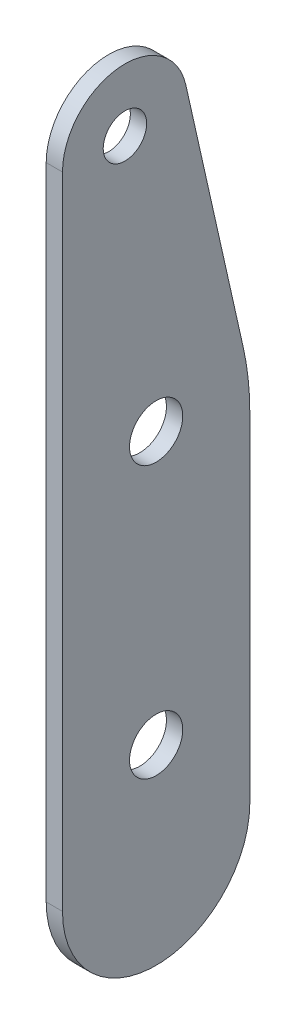
ISO-10303-21;
HEADER;
FILE_DESCRIPTION(('STEP AP214'),'2;1');
FILE_NAME('part.step','',(''),(''),'','','');
FILE_SCHEMA(('AUTOMOTIVE_DESIGN { 1 0 10303 214 1 1 1 1 }'));
ENDSEC;
DATA;
#1=APPLICATION_CONTEXT('core data for automotive mechanical design processes');
#2=APPLICATION_PROTOCOL_DEFINITION('international standard','automotive_design',2000,#1);
#3=PRODUCT_CONTEXT('',#1,'mechanical');
#4=PRODUCT('Part','Part','',(#3));
#5=PRODUCT_RELATED_PRODUCT_CATEGORY('part','',(#4));
#6=PRODUCT_DEFINITION_FORMATION('','',#4);
#7=PRODUCT_DEFINITION_CONTEXT('part definition',#1,'design');
#8=PRODUCT_DEFINITION('design','',#6,#7);
#9=PRODUCT_DEFINITION_SHAPE('','',#8);
#10=(LENGTH_UNIT() NAMED_UNIT(*) SI_UNIT(.MILLI.,.METRE.));
#11=(NAMED_UNIT(*) PLANE_ANGLE_UNIT() SI_UNIT($,.RADIAN.));
#12=(NAMED_UNIT(*) SI_UNIT($,.STERADIAN.) SOLID_ANGLE_UNIT());
#13=UNCERTAINTY_MEASURE_WITH_UNIT(LENGTH_MEASURE(1.E-05),#10,'distance_accuracy_value','');
#14=(GEOMETRIC_REPRESENTATION_CONTEXT(3) GLOBAL_UNCERTAINTY_ASSIGNED_CONTEXT((#13)) GLOBAL_UNIT_ASSIGNED_CONTEXT((#10,
#11,#12)) REPRESENTATION_CONTEXT('',''));
#15=CARTESIAN_POINT('',(0.,0.,0.));
#16=DIRECTION('',(0.,0.,1.));
#17=DIRECTION('',(1.,0.,0.));
#18=AXIS2_PLACEMENT_3D('',#15,#16,#17);
#19=CARTESIAN_POINT('',(1.524,-34.5069904318554,0.));
#20=DIRECTION('',(-1.,0.,0.));
#21=DIRECTION('',(0.,0.,1.));
#22=AXIS2_PLACEMENT_3D('',#19,#20,#21);
#23=PLANE('',#22);
#24=DIRECTION('',(0.,1.,0.));
#25=VECTOR('',#24,1.);
#26=CARTESIAN_POINT('',(1.524,-34.5069904318554,-8.763));
#27=LINE('',#26,#25);
#28=CARTESIAN_POINT('',(1.524,-34.5069904318554,-8.763));
#29=VERTEX_POINT('',#28);
#30=CARTESIAN_POINT('',(1.524,-2.8134837287877,-8.76299999999999));
#31=VERTEX_POINT('',#30);
#32=EDGE_CURVE('E84',#29,#31,#27,.T.);
#33=ORIENTED_EDGE('',*,*,#32,.T.);
#34=CARTESIAN_POINT('',(1.524,-2.81348372878769,16.637));
#35=DIRECTION('',(-1.,0.,0.));
#36=DIRECTION('',(0.,0.,1.));
#37=AXIS2_PLACEMENT_3D('',#34,#35,#36);
#38=CIRCLE('',#37,25.4);
#39=CARTESIAN_POINT('',(1.524,2.74528132198584,-8.14727184950767));
#40=VERTEX_POINT('',#39);
#41=EDGE_CURVE('E11',#31,#40,#38,.F.);
#42=ORIENTED_EDGE('',*,*,#41,.T.);
#43=DIRECTION('',(0.,0.975758734232586,0.218849017746989));
#44=VECTOR('',#43,1.);
#45=CARTESIAN_POINT('',(1.524,26.6785159616779,-2.77938252538677));
#46=LINE('',#45,#44);
#47=CARTESIAN_POINT('',(1.524,26.6785159616779,-2.77938252538677));
#48=VERTEX_POINT('',#47);
#49=EDGE_CURVE('E92',#40,#48,#46,.T.);
#50=ORIENTED_EDGE('',*,*,#49,.T.);
#51=CARTESIAN_POINT('',(1.524,25.4,2.921));
#52=DIRECTION('',(1.,0.,0.));
#53=DIRECTION('',(0.,0.,1.));
#54=AXIS2_PLACEMENT_3D('',#51,#52,#53);
#55=CIRCLE('',#54,5.842);
#56=CARTESIAN_POINT('',(1.524,25.4,8.763));
#57=VERTEX_POINT('',#56);
#58=EDGE_CURVE('E131',#48,#57,#55,.T.);
#59=ORIENTED_EDGE('',*,*,#58,.T.);
#60=DIRECTION('',(0.,-1.,0.));
#61=VECTOR('',#60,1.);
#62=CARTESIAN_POINT('',(1.524,-34.5069904318554,8.763));
#63=LINE('',#62,#61);
#64=CARTESIAN_POINT('',(1.524,-34.5069904318554,8.763));
#65=VERTEX_POINT('',#64);
#66=EDGE_CURVE('E98',#57,#65,#63,.T.);
#67=ORIENTED_EDGE('',*,*,#66,.T.);
#68=CARTESIAN_POINT('',(1.524,-34.5069904318554,0.));
#69=DIRECTION('',(1.,0.,0.));
#70=DIRECTION('',(0.,0.,1.));
#71=AXIS2_PLACEMENT_3D('',#68,#69,#70);
#72=CIRCLE('',#71,8.763);
#73=EDGE_CURVE('E93',#65,#29,#72,.T.);
#74=ORIENTED_EDGE('',*,*,#73,.T.);
#75=EDGE_LOOP('',(#33,#42,#50,#59,#67,#74));
#76=FACE_BOUND('',#75,.T.);
#77=CARTESIAN_POINT('',(1.524,0.,0.));
#78=DIRECTION('',(1.,0.,0.));
#79=DIRECTION('',(0.,0.,-1.));
#80=AXIS2_PLACEMENT_3D('',#77,#78,#79);
#81=CIRCLE('',#80,2.4892);
#82=CARTESIAN_POINT('',(1.524,0.,2.4892));
#83=VERTEX_POINT('',#82);
#84=EDGE_CURVE('E129',#83,#83,#81,.T.);
#85=ORIENTED_EDGE('',*,*,#84,.F.);
#86=EDGE_LOOP('',(#85));
#87=FACE_BOUND('',#86,.T.);
#88=CARTESIAN_POINT('',(1.524,-25.4,0.));
#89=DIRECTION('',(1.,0.,0.));
#90=DIRECTION('',(0.,0.,-1.));
#91=AXIS2_PLACEMENT_3D('',#88,#89,#90);
#92=CIRCLE('',#91,2.4892);
#93=CARTESIAN_POINT('',(1.524,-25.4,2.4892));
#94=VERTEX_POINT('',#93);
#95=EDGE_CURVE('E137',#94,#94,#92,.T.);
#96=ORIENTED_EDGE('',*,*,#95,.F.);
#97=EDGE_LOOP('',(#96));
#98=FACE_BOUND('',#97,.T.);
#99=CARTESIAN_POINT('',(1.524,25.4,2.921));
#100=DIRECTION('',(1.,0.,0.));
#101=DIRECTION('',(0.,0.,-1.));
#102=AXIS2_PLACEMENT_3D('',#99,#100,#101);
#103=CIRCLE('',#102,2.032);
#104=CARTESIAN_POINT('',(1.524,25.4,4.953));
#105=VERTEX_POINT('',#104);
#106=EDGE_CURVE('E143',#105,#105,#103,.T.);
#107=ORIENTED_EDGE('',*,*,#106,.F.);
#108=EDGE_LOOP('',(#107));
#109=FACE_BOUND('',#108,.T.);
#110=ADVANCED_FACE('F35',(#76,#87,#98,#109),#23,.F.);
#111=CARTESIAN_POINT('',(0.,-34.5069904318554,0.));
#112=DIRECTION('',(-1.,0.,0.));
#113=DIRECTION('',(0.,0.,1.));
#114=AXIS2_PLACEMENT_3D('',#111,#112,#113);
#115=PLANE('',#114);
#116=CARTESIAN_POINT('',(0.,-25.4,0.));
#117=DIRECTION('',(1.,0.,0.));
#118=DIRECTION('',(0.,0.,-1.));
#119=AXIS2_PLACEMENT_3D('',#116,#117,#118);
#120=CIRCLE('',#119,2.4892);
#121=CARTESIAN_POINT('',(0.,-25.4,2.4892));
#122=VERTEX_POINT('',#121);
#123=EDGE_CURVE('E140',#122,#122,#120,.T.);
#124=ORIENTED_EDGE('',*,*,#123,.T.);
#125=EDGE_LOOP('',(#124));
#126=FACE_BOUND('',#125,.T.);
#127=DIRECTION('',(0.,0.975758734232586,0.218849017746989));
#128=VECTOR('',#127,1.);
#129=CARTESIAN_POINT('',(0.,26.6785159616779,-2.77938252538677));
#130=LINE('',#129,#128);
#131=CARTESIAN_POINT('',(0.,2.74528132198584,-8.14727184950767));
#132=VERTEX_POINT('',#131);
#133=CARTESIAN_POINT('',(0.,26.6785159616779,-2.77938252538677));
#134=VERTEX_POINT('',#133);
#135=EDGE_CURVE('E124',#132,#134,#130,.T.);
#136=ORIENTED_EDGE('',*,*,#135,.F.);
#137=CARTESIAN_POINT('',(0.,-2.81348372878769,16.637));
#138=DIRECTION('',(-1.,0.,0.));
#139=DIRECTION('',(0.,0.,1.));
#140=AXIS2_PLACEMENT_3D('',#137,#138,#139);
#141=CIRCLE('',#140,25.4);
#142=CARTESIAN_POINT('',(0.,-2.8134837287877,-8.76299999999999));
#143=VERTEX_POINT('',#142);
#144=EDGE_CURVE('E57',#132,#143,#141,.T.);
#145=ORIENTED_EDGE('',*,*,#144,.T.);
#146=DIRECTION('',(0.,1.,0.));
#147=VECTOR('',#146,1.);
#148=CARTESIAN_POINT('',(0.,-34.5069904318554,-8.763));
#149=LINE('',#148,#147);
#150=CARTESIAN_POINT('',(0.,-34.5069904318554,-8.763));
#151=VERTEX_POINT('',#150);
#152=EDGE_CURVE('E126',#151,#143,#149,.T.);
#153=ORIENTED_EDGE('',*,*,#152,.F.);
#154=CARTESIAN_POINT('',(0.,-34.5069904318554,0.));
#155=DIRECTION('',(1.,0.,0.));
#156=DIRECTION('',(0.,0.,1.));
#157=AXIS2_PLACEMENT_3D('',#154,#155,#156);
#158=CIRCLE('',#157,8.763);
#159=CARTESIAN_POINT('',(0.,-34.5069904318554,8.763));
#160=VERTEX_POINT('',#159);
#161=EDGE_CURVE('E106',#160,#151,#158,.T.);
#162=ORIENTED_EDGE('',*,*,#161,.F.);
#163=DIRECTION('',(0.,-1.,0.));
#164=VECTOR('',#163,1.);
#165=CARTESIAN_POINT('',(0.,-34.5069904318554,8.763));
#166=LINE('',#165,#164);
#167=CARTESIAN_POINT('',(0.,25.4,8.763));
#168=VERTEX_POINT('',#167);
#169=EDGE_CURVE('E102',#168,#160,#166,.T.);
#170=ORIENTED_EDGE('',*,*,#169,.F.);
#171=CARTESIAN_POINT('',(0.,25.4,2.921));
#172=DIRECTION('',(1.,0.,0.));
#173=DIRECTION('',(0.,0.,1.));
#174=AXIS2_PLACEMENT_3D('',#171,#172,#173);
#175=CIRCLE('',#174,5.842);
#176=EDGE_CURVE('E122',#134,#168,#175,.T.);
#177=ORIENTED_EDGE('',*,*,#176,.F.);
#178=EDGE_LOOP('',(#136,#145,#153,#162,#170,#177));
#179=FACE_BOUND('',#178,.T.);
#180=CARTESIAN_POINT('',(0.,0.,0.));
#181=DIRECTION('',(1.,0.,0.));
#182=DIRECTION('',(0.,0.,-1.));
#183=AXIS2_PLACEMENT_3D('',#180,#181,#182);
#184=CIRCLE('',#183,2.4892);
#185=CARTESIAN_POINT('',(0.,0.,2.4892));
#186=VERTEX_POINT('',#185);
#187=EDGE_CURVE('E134',#186,#186,#184,.T.);
#188=ORIENTED_EDGE('',*,*,#187,.T.);
#189=EDGE_LOOP('',(#188));
#190=FACE_BOUND('',#189,.T.);
#191=CARTESIAN_POINT('',(0.,25.4,2.921));
#192=DIRECTION('',(1.,0.,0.));
#193=DIRECTION('',(0.,0.,-1.));
#194=AXIS2_PLACEMENT_3D('',#191,#192,#193);
#195=CIRCLE('',#194,2.032);
#196=CARTESIAN_POINT('',(0.,25.4,4.953));
#197=VERTEX_POINT('',#196);
#198=EDGE_CURVE('E146',#197,#197,#195,.T.);
#199=ORIENTED_EDGE('',*,*,#198,.T.);
#200=EDGE_LOOP('',(#199));
#201=FACE_BOUND('',#200,.T.);
#202=ADVANCED_FACE('F156',(#126,#179,#190,#201),#115,.T.);
#203=CARTESIAN_POINT('',(1.524,-34.5069904318554,0.));
#204=DIRECTION('',(-1.,0.,0.));
#205=DIRECTION('',(0.,0.,1.));
#206=AXIS2_PLACEMENT_3D('',#203,#204,#205);
#207=CYLINDRICAL_SURFACE('',#206,8.763);
#208=ORIENTED_EDGE('',*,*,#161,.T.);
#209=DIRECTION('',(-1.,0.,0.));
#210=VECTOR('',#209,1.);
#211=CARTESIAN_POINT('',(1.524,-34.5069904318554,-8.763));
#212=LINE('',#211,#210);
#213=EDGE_CURVE('E88',#29,#151,#212,.T.);
#214=ORIENTED_EDGE('',*,*,#213,.F.);
#215=ORIENTED_EDGE('',*,*,#73,.F.);
#216=DIRECTION('',(-1.,0.,0.));
#217=VECTOR('',#216,1.);
#218=CARTESIAN_POINT('',(1.524,-34.5069904318554,8.763));
#219=LINE('',#218,#217);
#220=EDGE_CURVE('E119',#65,#160,#219,.T.);
#221=ORIENTED_EDGE('',*,*,#220,.T.);
#222=EDGE_LOOP('',(#208,#214,#215,#221));
#223=FACE_BOUND('',#222,.T.);
#224=ADVANCED_FACE('F104',(#223),#207,.T.);
#225=CARTESIAN_POINT('',(1.524,-34.5069904318554,-8.763));
#226=DIRECTION('',(0.,0.,1.));
#227=DIRECTION('',(0.,-1.,0.));
#228=AXIS2_PLACEMENT_3D('',#225,#226,#227);
#229=PLANE('',#228);
#230=ORIENTED_EDGE('',*,*,#152,.T.);
#231=DIRECTION('',(-1.,0.,0.));
#232=VECTOR('',#231,1.);
#233=CARTESIAN_POINT('',(1.524,-2.81348372878769,-8.76299999999999));
#234=LINE('',#233,#232);
#235=EDGE_CURVE('E43',#143,#31,#234,.F.);
#236=ORIENTED_EDGE('',*,*,#235,.T.);
#237=ORIENTED_EDGE('',*,*,#32,.F.);
#238=ORIENTED_EDGE('',*,*,#213,.T.);
#239=EDGE_LOOP('',(#230,#236,#237,#238));
#240=FACE_BOUND('',#239,.T.);
#241=ADVANCED_FACE('F86',(#240),#229,.F.);
#242=CARTESIAN_POINT('',(1.524,26.6785159616779,-2.77938252538677));
#243=DIRECTION('',(0.,-0.218849017746989,0.975758734232586));
#244=DIRECTION('',(0.,-0.975758734232586,-0.218849017746989));
#245=AXIS2_PLACEMENT_3D('',#242,#243,#244);
#246=PLANE('',#245);
#247=ORIENTED_EDGE('',*,*,#49,.F.);
#248=DIRECTION('',(-1.,0.,0.));
#249=VECTOR('',#248,1.);
#250=CARTESIAN_POINT('',(1.524,2.74528132198584,-8.14727184950767));
#251=LINE('',#250,#249);
#252=EDGE_CURVE('E107',#40,#132,#251,.T.);
#253=ORIENTED_EDGE('',*,*,#252,.T.);
#254=ORIENTED_EDGE('',*,*,#135,.T.);
#255=DIRECTION('',(-1.,0.,0.));
#256=VECTOR('',#255,1.);
#257=CARTESIAN_POINT('',(1.524,26.6785159616779,-2.77938252538677));
#258=LINE('',#257,#256);
#259=EDGE_CURVE('E108',#48,#134,#258,.T.);
#260=ORIENTED_EDGE('',*,*,#259,.F.);
#261=EDGE_LOOP('',(#247,#253,#254,#260));
#262=FACE_BOUND('',#261,.T.);
#263=ADVANCED_FACE('F174',(#262),#246,.F.);
#264=CARTESIAN_POINT('',(1.524,25.4,2.921));
#265=DIRECTION('',(-1.,0.,0.));
#266=DIRECTION('',(0.,0.,1.));
#267=AXIS2_PLACEMENT_3D('',#264,#265,#266);
#268=CYLINDRICAL_SURFACE('',#267,5.842);
#269=ORIENTED_EDGE('',*,*,#176,.T.);
#270=DIRECTION('',(-1.,0.,0.));
#271=VECTOR('',#270,1.);
#272=CARTESIAN_POINT('',(1.524,25.4,8.763));
#273=LINE('',#272,#271);
#274=EDGE_CURVE('E113',#57,#168,#273,.T.);
#275=ORIENTED_EDGE('',*,*,#274,.F.);
#276=ORIENTED_EDGE('',*,*,#58,.F.);
#277=ORIENTED_EDGE('',*,*,#259,.T.);
#278=EDGE_LOOP('',(#269,#275,#276,#277));
#279=FACE_BOUND('',#278,.T.);
#280=ADVANCED_FACE('F170',(#279),#268,.T.);
#281=CARTESIAN_POINT('',(1.524,-34.5069904318554,8.763));
#282=DIRECTION('',(0.,0.,-1.));
#283=DIRECTION('',(-1.,0.,0.));
#284=AXIS2_PLACEMENT_3D('',#281,#282,#283);
#285=PLANE('',#284);
#286=ORIENTED_EDGE('',*,*,#169,.T.);
#287=ORIENTED_EDGE('',*,*,#220,.F.);
#288=ORIENTED_EDGE('',*,*,#66,.F.);
#289=ORIENTED_EDGE('',*,*,#274,.T.);
#290=EDGE_LOOP('',(#286,#287,#288,#289));
#291=FACE_BOUND('',#290,.T.);
#292=ADVANCED_FACE('F167',(#291),#285,.F.);
#293=CARTESIAN_POINT('',(1.524,0.,0.));
#294=DIRECTION('',(-1.,0.,0.));
#295=DIRECTION('',(0.,0.,1.));
#296=AXIS2_PLACEMENT_3D('',#293,#294,#295);
#297=CYLINDRICAL_SURFACE('',#296,2.4892);
#298=CARTESIAN_POINT('',(1.524,0.,2.4892));
#299=CARTESIAN_POINT('',(1.508125,0.,2.4892));
#300=CARTESIAN_POINT('',(1.49225,0.,2.4892));
#301=CARTESIAN_POINT('',(1.4605,0.,2.4892));
#302=CARTESIAN_POINT('',(1.444625,0.,2.4892));
#303=CARTESIAN_POINT('',(1.412875,0.,2.4892));
#304=CARTESIAN_POINT('',(1.397,0.,2.4892));
#305=CARTESIAN_POINT('',(1.36525,0.,2.4892));
#306=CARTESIAN_POINT('',(1.349375,0.,2.4892));
#307=CARTESIAN_POINT('',(1.317625,0.,2.4892));
#308=CARTESIAN_POINT('',(1.30175,0.,2.4892));
#309=CARTESIAN_POINT('',(1.27,0.,2.4892));
#310=CARTESIAN_POINT('',(1.254125,0.,2.4892));
#311=CARTESIAN_POINT('',(1.222375,0.,2.4892));
#312=CARTESIAN_POINT('',(1.2065,0.,2.4892));
#313=CARTESIAN_POINT('',(1.17475,0.,2.4892));
#314=CARTESIAN_POINT('',(1.158875,0.,2.4892));
#315=CARTESIAN_POINT('',(1.127125,0.,2.4892));
#316=CARTESIAN_POINT('',(1.11125,0.,2.4892));
#317=CARTESIAN_POINT('',(1.0795,0.,2.4892));
#318=CARTESIAN_POINT('',(1.063625,0.,2.4892));
#319=CARTESIAN_POINT('',(1.031875,0.,2.4892));
#320=CARTESIAN_POINT('',(1.016,0.,2.4892));
#321=CARTESIAN_POINT('',(0.98425,0.,2.4892));
#322=CARTESIAN_POINT('',(0.968375,0.,2.4892));
#323=CARTESIAN_POINT('',(0.936625,0.,2.4892));
#324=CARTESIAN_POINT('',(0.92075,0.,2.4892));
#325=CARTESIAN_POINT('',(0.889,0.,2.4892));
#326=CARTESIAN_POINT('',(0.873125,0.,2.4892));
#327=CARTESIAN_POINT('',(0.841375,0.,2.4892));
#328=CARTESIAN_POINT('',(0.8255,0.,2.4892));
#329=CARTESIAN_POINT('',(0.79375,0.,2.4892));
#330=CARTESIAN_POINT('',(0.777875,0.,2.4892));
#331=CARTESIAN_POINT('',(0.746125,0.,2.4892));
#332=CARTESIAN_POINT('',(0.73025,0.,2.4892));
#333=CARTESIAN_POINT('',(0.6985,0.,2.4892));
#334=CARTESIAN_POINT('',(0.682625,0.,2.4892));
#335=CARTESIAN_POINT('',(0.650875,0.,2.4892));
#336=CARTESIAN_POINT('',(0.635,0.,2.4892));
#337=CARTESIAN_POINT('',(0.60325,0.,2.4892));
#338=CARTESIAN_POINT('',(0.587375,0.,2.4892));
#339=CARTESIAN_POINT('',(0.555625,0.,2.4892));
#340=CARTESIAN_POINT('',(0.53975,0.,2.4892));
#341=CARTESIAN_POINT('',(0.508,0.,2.4892));
#342=CARTESIAN_POINT('',(0.492125,0.,2.4892));
#343=CARTESIAN_POINT('',(0.460375,0.,2.4892));
#344=CARTESIAN_POINT('',(0.4445,0.,2.4892));
#345=CARTESIAN_POINT('',(0.41275,0.,2.4892));
#346=CARTESIAN_POINT('',(0.396875,0.,2.4892));
#347=CARTESIAN_POINT('',(0.365125,0.,2.4892));
#348=CARTESIAN_POINT('',(0.34925,0.,2.4892));
#349=CARTESIAN_POINT('',(0.3175,0.,2.4892));
#350=CARTESIAN_POINT('',(0.301625,0.,2.4892));
#351=CARTESIAN_POINT('',(0.269875,0.,2.4892));
#352=CARTESIAN_POINT('',(0.254,0.,2.4892));
#353=CARTESIAN_POINT('',(0.22225,0.,2.4892));
#354=CARTESIAN_POINT('',(0.206375,0.,2.4892));
#355=CARTESIAN_POINT('',(0.174625,0.,2.4892));
#356=CARTESIAN_POINT('',(0.15875,0.,2.4892));
#357=CARTESIAN_POINT('',(0.127,0.,2.4892));
#358=CARTESIAN_POINT('',(0.111125,0.,2.4892));
#359=CARTESIAN_POINT('',(0.079375,0.,2.4892));
#360=CARTESIAN_POINT('',(0.0635,0.,2.4892));
#361=CARTESIAN_POINT('',(0.0317499999999999,0.,2.4892));
#362=CARTESIAN_POINT('',(0.015875,0.,2.4892));
#363=CARTESIAN_POINT('',(0.,0.,2.4892));
#364=B_SPLINE_CURVE_WITH_KNOTS('',3,(#298,#299,#300,#301,#302,#303,#304,#305,#306,#307,#308,
#309,#310,#311,#312,#313,#314,#315,#316,#317,#318,#319,#320,#321,#322,#323,#324,#325,#326,#327,
#328,#329,#330,#331,#332,#333,#334,#335,#336,#337,#338,#339,#340,#341,#342,#343,#344,#345,#346,
#347,#348,#349,#350,#351,#352,#353,#354,#355,#356,#357,#358,#359,#360,#361,#362,#363),
.UNSPECIFIED.,.F.,.F.,(4,2,2,2,2,2,2,2,2,2,2,2,2,2,2,2,2,2,2,2,2,2,2,2,2,2,2,2,2,2,2,2,4),(0.,
0.0476250000000001,0.0952500000000001,0.142875,0.1905,0.238125,0.28575,0.333375,0.381,0.428625,
0.47625,0.523875,0.5715,0.619125,0.66675,0.714375,0.762,0.809625,0.85725,0.904875,0.9525,
1.000125,1.04775,1.095375,1.143,1.190625,1.23825,1.285875,1.3335,1.381125,1.42875,1.476375,
1.524),.UNSPECIFIED.);
#365=EDGE_CURVE('BSEAM164',#83,#186,#364,.T.);
#366=ORIENTED_EDGE('',*,*,#84,.T.);
#367=ORIENTED_EDGE('',*,*,#187,.F.);
#368=ORIENTED_EDGE('',*,*,#365,.T.);
#369=ORIENTED_EDGE('',*,*,#365,.F.);
#370=EDGE_LOOP('',(#366,#368,#367,#369));
#371=FACE_BOUND('',#370,.T.);
#372=ADVANCED_FACE('F164',(#371),#297,.F.);
#373=CARTESIAN_POINT('',(1.524,-25.4,0.));
#374=DIRECTION('',(-1.,0.,0.));
#375=DIRECTION('',(0.,0.,1.));
#376=AXIS2_PLACEMENT_3D('',#373,#374,#375);
#377=CYLINDRICAL_SURFACE('',#376,2.4892);
#378=CARTESIAN_POINT('',(1.524,-25.4,2.4892));
#379=CARTESIAN_POINT('',(1.508125,-25.4,2.4892));
#380=CARTESIAN_POINT('',(1.49225,-25.4,2.4892));
#381=CARTESIAN_POINT('',(1.4605,-25.4,2.4892));
#382=CARTESIAN_POINT('',(1.444625,-25.4,2.4892));
#383=CARTESIAN_POINT('',(1.412875,-25.4,2.4892));
#384=CARTESIAN_POINT('',(1.397,-25.4,2.4892));
#385=CARTESIAN_POINT('',(1.36525,-25.4,2.4892));
#386=CARTESIAN_POINT('',(1.349375,-25.4,2.4892));
#387=CARTESIAN_POINT('',(1.317625,-25.4,2.4892));
#388=CARTESIAN_POINT('',(1.30175,-25.4,2.4892));
#389=CARTESIAN_POINT('',(1.27,-25.4,2.4892));
#390=CARTESIAN_POINT('',(1.254125,-25.4,2.4892));
#391=CARTESIAN_POINT('',(1.222375,-25.4,2.4892));
#392=CARTESIAN_POINT('',(1.2065,-25.4,2.4892));
#393=CARTESIAN_POINT('',(1.17475,-25.4,2.4892));
#394=CARTESIAN_POINT('',(1.158875,-25.4,2.4892));
#395=CARTESIAN_POINT('',(1.127125,-25.4,2.4892));
#396=CARTESIAN_POINT('',(1.11125,-25.4,2.4892));
#397=CARTESIAN_POINT('',(1.0795,-25.4,2.4892));
#398=CARTESIAN_POINT('',(1.063625,-25.4,2.4892));
#399=CARTESIAN_POINT('',(1.031875,-25.4,2.4892));
#400=CARTESIAN_POINT('',(1.016,-25.4,2.4892));
#401=CARTESIAN_POINT('',(0.98425,-25.4,2.4892));
#402=CARTESIAN_POINT('',(0.968375,-25.4,2.4892));
#403=CARTESIAN_POINT('',(0.936625,-25.4,2.4892));
#404=CARTESIAN_POINT('',(0.92075,-25.4,2.4892));
#405=CARTESIAN_POINT('',(0.889,-25.4,2.4892));
#406=CARTESIAN_POINT('',(0.873125,-25.4,2.4892));
#407=CARTESIAN_POINT('',(0.841375,-25.4,2.4892));
#408=CARTESIAN_POINT('',(0.8255,-25.4,2.4892));
#409=CARTESIAN_POINT('',(0.79375,-25.4,2.4892));
#410=CARTESIAN_POINT('',(0.777875,-25.4,2.4892));
#411=CARTESIAN_POINT('',(0.746125,-25.4,2.4892));
#412=CARTESIAN_POINT('',(0.73025,-25.4,2.4892));
#413=CARTESIAN_POINT('',(0.6985,-25.4,2.4892));
#414=CARTESIAN_POINT('',(0.682625,-25.4,2.4892));
#415=CARTESIAN_POINT('',(0.650875,-25.4,2.4892));
#416=CARTESIAN_POINT('',(0.635,-25.4,2.4892));
#417=CARTESIAN_POINT('',(0.60325,-25.4,2.4892));
#418=CARTESIAN_POINT('',(0.587375,-25.4,2.4892));
#419=CARTESIAN_POINT('',(0.555625,-25.4,2.4892));
#420=CARTESIAN_POINT('',(0.53975,-25.4,2.4892));
#421=CARTESIAN_POINT('',(0.508,-25.4,2.4892));
#422=CARTESIAN_POINT('',(0.492125,-25.4,2.4892));
#423=CARTESIAN_POINT('',(0.460375,-25.4,2.4892));
#424=CARTESIAN_POINT('',(0.4445,-25.4,2.4892));
#425=CARTESIAN_POINT('',(0.41275,-25.4,2.4892));
#426=CARTESIAN_POINT('',(0.396875,-25.4,2.4892));
#427=CARTESIAN_POINT('',(0.365125,-25.4,2.4892));
#428=CARTESIAN_POINT('',(0.34925,-25.4,2.4892));
#429=CARTESIAN_POINT('',(0.3175,-25.4,2.4892));
#430=CARTESIAN_POINT('',(0.301625,-25.4,2.4892));
#431=CARTESIAN_POINT('',(0.269875,-25.4,2.4892));
#432=CARTESIAN_POINT('',(0.254,-25.4,2.4892));
#433=CARTESIAN_POINT('',(0.22225,-25.4,2.4892));
#434=CARTESIAN_POINT('',(0.206375,-25.4,2.4892));
#435=CARTESIAN_POINT('',(0.174625,-25.4,2.4892));
#436=CARTESIAN_POINT('',(0.15875,-25.4,2.4892));
#437=CARTESIAN_POINT('',(0.127,-25.4,2.4892));
#438=CARTESIAN_POINT('',(0.111125,-25.4,2.4892));
#439=CARTESIAN_POINT('',(0.079375,-25.4,2.4892));
#440=CARTESIAN_POINT('',(0.0635,-25.4,2.4892));
#441=CARTESIAN_POINT('',(0.0317499999999999,-25.4,2.4892));
#442=CARTESIAN_POINT('',(0.015875,-25.4,2.4892));
#443=CARTESIAN_POINT('',(0.,-25.4,2.4892));
#444=B_SPLINE_CURVE_WITH_KNOTS('',3,(#378,#379,#380,#381,#382,#383,#384,#385,#386,#387,#388,
#389,#390,#391,#392,#393,#394,#395,#396,#397,#398,#399,#400,#401,#402,#403,#404,#405,#406,#407,
#408,#409,#410,#411,#412,#413,#414,#415,#416,#417,#418,#419,#420,#421,#422,#423,#424,#425,#426,
#427,#428,#429,#430,#431,#432,#433,#434,#435,#436,#437,#438,#439,#440,#441,#442,#443),
.UNSPECIFIED.,.F.,.F.,(4,2,2,2,2,2,2,2,2,2,2,2,2,2,2,2,2,2,2,2,2,2,2,2,2,2,2,2,2,2,2,2,4),(0.,
0.0476250000000001,0.0952500000000001,0.142875,0.1905,0.238125,0.28575,0.333375,0.381,0.428625,
0.47625,0.523875,0.5715,0.619125,0.66675,0.714375,0.762,0.809625,0.85725,0.904875,0.9525,
1.000125,1.04775,1.095375,1.143,1.190625,1.23825,1.285875,1.3335,1.381125,1.42875,1.476375,
1.524),.UNSPECIFIED.);
#445=EDGE_CURVE('BSEAM208',#94,#122,#444,.T.);
#446=ORIENTED_EDGE('',*,*,#95,.T.);
#447=ORIENTED_EDGE('',*,*,#123,.F.);
#448=ORIENTED_EDGE('',*,*,#445,.T.);
#449=ORIENTED_EDGE('',*,*,#445,.F.);
#450=EDGE_LOOP('',(#446,#448,#447,#449));
#451=FACE_BOUND('',#450,.T.);
#452=ADVANCED_FACE('F208',(#451),#377,.F.);
#453=CARTESIAN_POINT('',(1.524,25.4,2.921));
#454=DIRECTION('',(-1.,0.,0.));
#455=DIRECTION('',(0.,0.,1.));
#456=AXIS2_PLACEMENT_3D('',#453,#454,#455);
#457=CYLINDRICAL_SURFACE('',#456,2.032);
#458=CARTESIAN_POINT('',(1.524,25.4,4.953));
#459=CARTESIAN_POINT('',(1.508125,25.4,4.953));
#460=CARTESIAN_POINT('',(1.49225,25.4,4.953));
#461=CARTESIAN_POINT('',(1.4605,25.4,4.953));
#462=CARTESIAN_POINT('',(1.444625,25.4,4.953));
#463=CARTESIAN_POINT('',(1.412875,25.4,4.953));
#464=CARTESIAN_POINT('',(1.397,25.4,4.953));
#465=CARTESIAN_POINT('',(1.36525,25.4,4.953));
#466=CARTESIAN_POINT('',(1.349375,25.4,4.953));
#467=CARTESIAN_POINT('',(1.317625,25.4,4.953));
#468=CARTESIAN_POINT('',(1.30175,25.4,4.953));
#469=CARTESIAN_POINT('',(1.27,25.4,4.953));
#470=CARTESIAN_POINT('',(1.254125,25.4,4.953));
#471=CARTESIAN_POINT('',(1.222375,25.4,4.953));
#472=CARTESIAN_POINT('',(1.2065,25.4,4.953));
#473=CARTESIAN_POINT('',(1.17475,25.4,4.953));
#474=CARTESIAN_POINT('',(1.158875,25.4,4.953));
#475=CARTESIAN_POINT('',(1.127125,25.4,4.953));
#476=CARTESIAN_POINT('',(1.11125,25.4,4.953));
#477=CARTESIAN_POINT('',(1.0795,25.4,4.953));
#478=CARTESIAN_POINT('',(1.063625,25.4,4.953));
#479=CARTESIAN_POINT('',(1.031875,25.4,4.953));
#480=CARTESIAN_POINT('',(1.016,25.4,4.953));
#481=CARTESIAN_POINT('',(0.98425,25.4,4.953));
#482=CARTESIAN_POINT('',(0.968375,25.4,4.953));
#483=CARTESIAN_POINT('',(0.936625,25.4,4.953));
#484=CARTESIAN_POINT('',(0.92075,25.4,4.953));
#485=CARTESIAN_POINT('',(0.889,25.4,4.953));
#486=CARTESIAN_POINT('',(0.873125,25.4,4.953));
#487=CARTESIAN_POINT('',(0.841375,25.4,4.953));
#488=CARTESIAN_POINT('',(0.8255,25.4,4.953));
#489=CARTESIAN_POINT('',(0.79375,25.4,4.953));
#490=CARTESIAN_POINT('',(0.777875,25.4,4.953));
#491=CARTESIAN_POINT('',(0.746125,25.4,4.953));
#492=CARTESIAN_POINT('',(0.73025,25.4,4.953));
#493=CARTESIAN_POINT('',(0.6985,25.4,4.953));
#494=CARTESIAN_POINT('',(0.682625,25.4,4.953));
#495=CARTESIAN_POINT('',(0.650875,25.4,4.953));
#496=CARTESIAN_POINT('',(0.635,25.4,4.953));
#497=CARTESIAN_POINT('',(0.60325,25.4,4.953));
#498=CARTESIAN_POINT('',(0.587375,25.4,4.953));
#499=CARTESIAN_POINT('',(0.555625,25.4,4.953));
#500=CARTESIAN_POINT('',(0.53975,25.4,4.953));
#501=CARTESIAN_POINT('',(0.508,25.4,4.953));
#502=CARTESIAN_POINT('',(0.492125,25.4,4.953));
#503=CARTESIAN_POINT('',(0.460375,25.4,4.953));
#504=CARTESIAN_POINT('',(0.4445,25.4,4.953));
#505=CARTESIAN_POINT('',(0.41275,25.4,4.953));
#506=CARTESIAN_POINT('',(0.396875,25.4,4.953));
#507=CARTESIAN_POINT('',(0.365125,25.4,4.953));
#508=CARTESIAN_POINT('',(0.34925,25.4,4.953));
#509=CARTESIAN_POINT('',(0.3175,25.4,4.953));
#510=CARTESIAN_POINT('',(0.301625,25.4,4.953));
#511=CARTESIAN_POINT('',(0.269875,25.4,4.953));
#512=CARTESIAN_POINT('',(0.254,25.4,4.953));
#513=CARTESIAN_POINT('',(0.22225,25.4,4.953));
#514=CARTESIAN_POINT('',(0.206375,25.4,4.953));
#515=CARTESIAN_POINT('',(0.174625,25.4,4.953));
#516=CARTESIAN_POINT('',(0.15875,25.4,4.953));
#517=CARTESIAN_POINT('',(0.127,25.4,4.953));
#518=CARTESIAN_POINT('',(0.111125,25.4,4.953));
#519=CARTESIAN_POINT('',(0.079375,25.4,4.953));
#520=CARTESIAN_POINT('',(0.0635,25.4,4.953));
#521=CARTESIAN_POINT('',(0.0317499999999999,25.4,4.953));
#522=CARTESIAN_POINT('',(0.015875,25.4,4.953));
#523=CARTESIAN_POINT('',(0.,25.4,4.953));
#524=B_SPLINE_CURVE_WITH_KNOTS('',3,(#458,#459,#460,#461,#462,#463,#464,#465,#466,#467,#468,
#469,#470,#471,#472,#473,#474,#475,#476,#477,#478,#479,#480,#481,#482,#483,#484,#485,#486,#487,
#488,#489,#490,#491,#492,#493,#494,#495,#496,#497,#498,#499,#500,#501,#502,#503,#504,#505,#506,
#507,#508,#509,#510,#511,#512,#513,#514,#515,#516,#517,#518,#519,#520,#521,#522,#523),
.UNSPECIFIED.,.F.,.F.,(4,2,2,2,2,2,2,2,2,2,2,2,2,2,2,2,2,2,2,2,2,2,2,2,2,2,2,2,2,2,2,2,4),(0.,
0.0476250000000001,0.0952500000000001,0.142875,0.1905,0.238125,0.28575,0.333375,0.381,0.428625,
0.47625,0.523875,0.5715,0.619125,0.66675,0.714375,0.762,0.809625,0.85725,0.904875,0.9525,
1.000125,1.04775,1.095375,1.143,1.190625,1.23825,1.285875,1.3335,1.381125,1.42875,1.476375,
1.524),.UNSPECIFIED.);
#525=EDGE_CURVE('BSEAM152',#105,#197,#524,.T.);
#526=ORIENTED_EDGE('',*,*,#106,.T.);
#527=ORIENTED_EDGE('',*,*,#198,.F.);
#528=ORIENTED_EDGE('',*,*,#525,.T.);
#529=ORIENTED_EDGE('',*,*,#525,.F.);
#530=EDGE_LOOP('',(#526,#528,#527,#529));
#531=FACE_BOUND('',#530,.T.);
#532=ADVANCED_FACE('F152',(#531),#457,.F.);
#533=CARTESIAN_POINT('',(1.524,-2.81348372878769,16.637));
#534=DIRECTION('',(-1.,0.,0.));
#535=DIRECTION('',(0.,0.,1.));
#536=AXIS2_PLACEMENT_3D('',#533,#534,#535);
#537=CYLINDRICAL_SURFACE('',#536,25.4);
#538=ORIENTED_EDGE('',*,*,#41,.F.);
#539=ORIENTED_EDGE('',*,*,#235,.F.);
#540=ORIENTED_EDGE('',*,*,#144,.F.);
#541=ORIENTED_EDGE('',*,*,#252,.F.);
#542=EDGE_LOOP('',(#538,#539,#540,#541));
#543=FACE_BOUND('',#542,.T.);
#544=ADVANCED_FACE('F37',(#543),#537,.T.);
#545=CLOSED_SHELL('',(#110,#202,#224,#241,#263,#280,#292,#372,#452,#532,#544));
#546=MANIFOLD_SOLID_BREP('B2',#545);
#547=ADVANCED_BREP_SHAPE_REPRESENTATION('',(#18,#546),#14);
#548=SHAPE_DEFINITION_REPRESENTATION(#9,#547);
ENDSEC;
END-ISO-10303-21;
